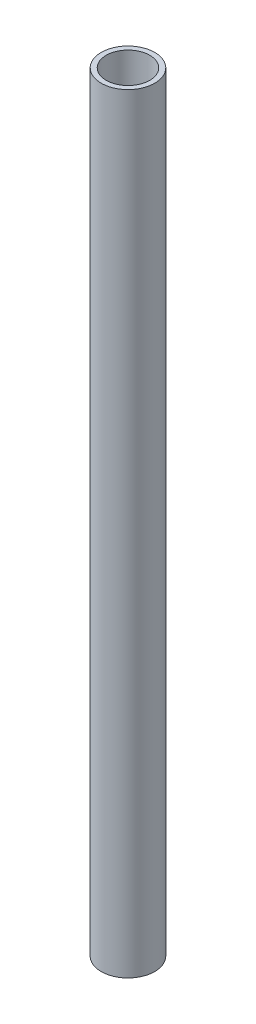
ISO-10303-21;
HEADER;
FILE_DESCRIPTION(('STEP AP214'),'2;1');
FILE_NAME('part.step','',(''),(''),'','','');
FILE_SCHEMA(('AUTOMOTIVE_DESIGN { 1 0 10303 214 1 1 1 1 }'));
ENDSEC;
DATA;
#1=APPLICATION_CONTEXT('core data for automotive mechanical design processes');
#2=APPLICATION_PROTOCOL_DEFINITION('international standard','automotive_design',2000,#1);
#3=PRODUCT_CONTEXT('',#1,'mechanical');
#4=PRODUCT('Part','Part','',(#3));
#5=PRODUCT_RELATED_PRODUCT_CATEGORY('part','',(#4));
#6=PRODUCT_DEFINITION_FORMATION('','',#4);
#7=PRODUCT_DEFINITION_CONTEXT('part definition',#1,'design');
#8=PRODUCT_DEFINITION('design','',#6,#7);
#9=PRODUCT_DEFINITION_SHAPE('','',#8);
#10=(LENGTH_UNIT() NAMED_UNIT(*) SI_UNIT(.MILLI.,.METRE.));
#11=(NAMED_UNIT(*) PLANE_ANGLE_UNIT() SI_UNIT($,.RADIAN.));
#12=(NAMED_UNIT(*) SI_UNIT($,.STERADIAN.) SOLID_ANGLE_UNIT());
#13=UNCERTAINTY_MEASURE_WITH_UNIT(LENGTH_MEASURE(1.E-05),#10,'distance_accuracy_value','');
#14=(GEOMETRIC_REPRESENTATION_CONTEXT(3) GLOBAL_UNCERTAINTY_ASSIGNED_CONTEXT((#13)) GLOBAL_UNIT_ASSIGNED_CONTEXT((#10,
#11,#12)) REPRESENTATION_CONTEXT('',''));
#15=CARTESIAN_POINT('',(0.,0.,0.));
#16=DIRECTION('',(0.,0.,1.));
#17=DIRECTION('',(1.,0.,0.));
#18=AXIS2_PLACEMENT_3D('',#15,#16,#17);
#19=CARTESIAN_POINT('',(0.,276.27761174584,0.));
#20=DIRECTION('',(0.,-1.,0.));
#21=DIRECTION('',(0.,0.,-1.));
#22=AXIS2_PLACEMENT_3D('',#19,#20,#21);
#23=CYLINDRICAL_SURFACE('',#22,7.9375);
#24=CARTESIAN_POINT('',(0.,0.,0.));
#25=DIRECTION('',(0.,1.,0.));
#26=DIRECTION('',(0.,0.,1.));
#27=AXIS2_PLACEMENT_3D('',#24,#25,#26);
#28=CIRCLE('',#27,7.9375);
#29=CARTESIAN_POINT('',(0.,0.,7.9375));
#30=VERTEX_POINT('',#29);
#31=EDGE_CURVE('E41',#30,#30,#28,.T.);
#32=ORIENTED_EDGE('',*,*,#31,.T.);
#33=EDGE_LOOP('',(#32));
#34=FACE_BOUND('',#33,.T.);
#35=CARTESIAN_POINT('',(0.,228.426971443168,0.));
#36=DIRECTION('',(0.,1.,0.));
#37=DIRECTION('',(-1.,0.,0.));
#38=AXIS2_PLACEMENT_3D('',#35,#36,#37);
#39=CIRCLE('',#38,7.9375);
#40=CARTESIAN_POINT('',(-7.9375,228.426971443168,0.));
#41=VERTEX_POINT('',#40);
#42=EDGE_CURVE('E11',#41,#41,#39,.T.);
#43=ORIENTED_EDGE('',*,*,#42,.F.);
#44=EDGE_LOOP('',(#43));
#45=FACE_BOUND('',#44,.T.);
#46=ADVANCED_FACE('F34',(#34,#45),#23,.T.);
#47=CARTESIAN_POINT('',(0.,0.,0.));
#48=DIRECTION('',(0.,1.,0.));
#49=DIRECTION('',(0.,0.,1.));
#50=AXIS2_PLACEMENT_3D('',#47,#48,#49);
#51=PLANE('',#50);
#52=ORIENTED_EDGE('',*,*,#31,.F.);
#53=EDGE_LOOP('',(#52));
#54=FACE_BOUND('',#53,.T.);
#55=CARTESIAN_POINT('',(0.,0.,0.));
#56=DIRECTION('',(0.,1.,0.));
#57=DIRECTION('',(0.,0.,1.));
#58=AXIS2_PLACEMENT_3D('',#55,#56,#57);
#59=CIRCLE('',#58,6.4643);
#60=CARTESIAN_POINT('',(0.,0.,6.4643));
#61=VERTEX_POINT('',#60);
#62=EDGE_CURVE('E46',#61,#61,#59,.T.);
#63=ORIENTED_EDGE('',*,*,#62,.T.);
#64=EDGE_LOOP('',(#63));
#65=FACE_BOUND('',#64,.T.);
#66=ADVANCED_FACE('F62',(#54,#65),#51,.F.);
#67=CARTESIAN_POINT('',(0.,276.27761174584,0.));
#68=DIRECTION('',(0.,-1.,0.));
#69=DIRECTION('',(0.,0.,-1.));
#70=AXIS2_PLACEMENT_3D('',#67,#68,#69);
#71=CYLINDRICAL_SURFACE('',#70,6.4643);
#72=ORIENTED_EDGE('',*,*,#62,.F.);
#73=EDGE_LOOP('',(#72));
#74=FACE_BOUND('',#73,.T.);
#75=CARTESIAN_POINT('',(0.,228.426971443168,0.));
#76=DIRECTION('',(0.,1.,0.));
#77=DIRECTION('',(-1.,0.,0.));
#78=AXIS2_PLACEMENT_3D('',#75,#76,#77);
#79=CIRCLE('',#78,6.4643);
#80=CARTESIAN_POINT('',(-6.4643,228.426971443168,0.));
#81=VERTEX_POINT('',#80);
#82=EDGE_CURVE('E37',#81,#81,#79,.T.);
#83=ORIENTED_EDGE('',*,*,#82,.T.);
#84=EDGE_LOOP('',(#83));
#85=FACE_BOUND('',#84,.T.);
#86=ADVANCED_FACE('F54',(#74,#85),#71,.F.);
#87=CARTESIAN_POINT('',(0.,228.426971443168,3.17500000000001));
#88=DIRECTION('',(0.,1.,0.));
#89=DIRECTION('',(-1.,0.,0.));
#90=AXIS2_PLACEMENT_3D('',#87,#88,#89);
#91=PLANE('',#90);
#92=ORIENTED_EDGE('',*,*,#82,.F.);
#93=EDGE_LOOP('',(#92));
#94=FACE_BOUND('',#93,.T.);
#95=ORIENTED_EDGE('',*,*,#42,.T.);
#96=EDGE_LOOP('',(#95));
#97=FACE_BOUND('',#96,.T.);
#98=ADVANCED_FACE('F56',(#94,#97),#91,.T.);
#99=CLOSED_SHELL('',(#46,#66,#86,#98));
#100=MANIFOLD_SOLID_BREP('B2',#99);
#101=ADVANCED_BREP_SHAPE_REPRESENTATION('',(#18,#100),#14);
#102=SHAPE_DEFINITION_REPRESENTATION(#9,#101);
ENDSEC;
END-ISO-10303-21;
